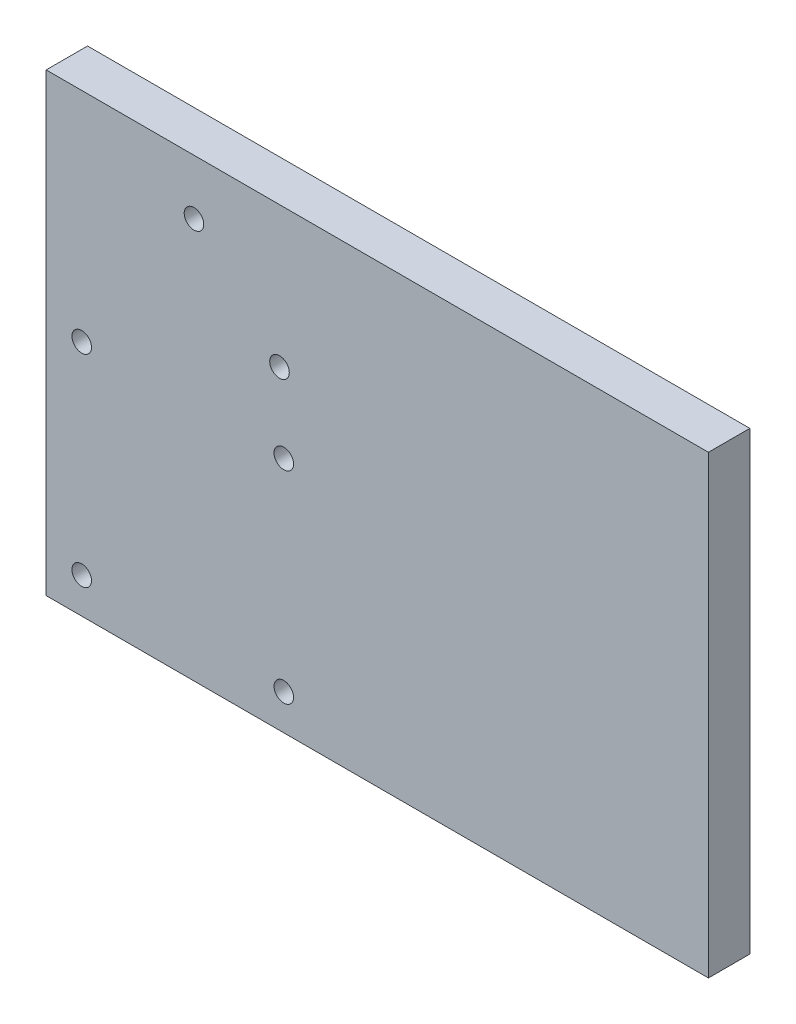
ISO-10303-21;
HEADER;
FILE_DESCRIPTION(('STEP AP214'),'2;1');
FILE_NAME('part.step','',(''),(''),'','','');
FILE_SCHEMA(('AUTOMOTIVE_DESIGN { 1 0 10303 214 1 1 1 1 }'));
ENDSEC;
DATA;
#1=APPLICATION_CONTEXT('core data for automotive mechanical design processes');
#2=APPLICATION_PROTOCOL_DEFINITION('international standard','automotive_design',2000,#1);
#3=PRODUCT_CONTEXT('',#1,'mechanical');
#4=PRODUCT('Part','Part','',(#3));
#5=PRODUCT_RELATED_PRODUCT_CATEGORY('part','',(#4));
#6=PRODUCT_DEFINITION_FORMATION('','',#4);
#7=PRODUCT_DEFINITION_CONTEXT('part definition',#1,'design');
#8=PRODUCT_DEFINITION('design','',#6,#7);
#9=PRODUCT_DEFINITION_SHAPE('','',#8);
#10=(LENGTH_UNIT() NAMED_UNIT(*) SI_UNIT(.MILLI.,.METRE.));
#11=(NAMED_UNIT(*) PLANE_ANGLE_UNIT() SI_UNIT($,.RADIAN.));
#12=(NAMED_UNIT(*) SI_UNIT($,.STERADIAN.) SOLID_ANGLE_UNIT());
#13=UNCERTAINTY_MEASURE_WITH_UNIT(LENGTH_MEASURE(1.E-05),#10,'distance_accuracy_value','');
#14=(GEOMETRIC_REPRESENTATION_CONTEXT(3) GLOBAL_UNCERTAINTY_ASSIGNED_CONTEXT((#13)) GLOBAL_UNIT_ASSIGNED_CONTEXT((#10,
#11,#12)) REPRESENTATION_CONTEXT('',''));
#15=CARTESIAN_POINT('',(0.,0.,0.));
#16=DIRECTION('',(0.,0.,1.));
#17=DIRECTION('',(1.,0.,0.));
#18=AXIS2_PLACEMENT_3D('',#15,#16,#17);
#19=CARTESIAN_POINT('',(0.,0.,6.35));
#20=DIRECTION('',(1.,0.,0.));
#21=DIRECTION('',(0.,0.,-1.));
#22=AXIS2_PLACEMENT_3D('',#19,#20,#21);
#23=PLANE('',#22);
#24=DIRECTION('',(0.,-1.,0.));
#25=VECTOR('',#24,1.);
#26=CARTESIAN_POINT('',(0.,0.,0.));
#27=LINE('',#26,#25);
#28=CARTESIAN_POINT('',(0.,69.85,0.));
#29=VERTEX_POINT('',#28);
#30=CARTESIAN_POINT('',(0.,0.,0.));
#31=VERTEX_POINT('',#30);
#32=EDGE_CURVE('E96',#29,#31,#27,.T.);
#33=ORIENTED_EDGE('',*,*,#32,.T.);
#34=DIRECTION('',(0.,0.,-1.));
#35=VECTOR('',#34,1.);
#36=CARTESIAN_POINT('',(0.,0.,6.35));
#37=LINE('',#36,#35);
#38=CARTESIAN_POINT('',(0.,0.,6.35));
#39=VERTEX_POINT('',#38);
#40=EDGE_CURVE('E11',#39,#31,#37,.T.);
#41=ORIENTED_EDGE('',*,*,#40,.F.);
#42=DIRECTION('',(0.,-1.,0.));
#43=VECTOR('',#42,1.);
#44=CARTESIAN_POINT('',(0.,0.,6.35));
#45=LINE('',#44,#43);
#46=CARTESIAN_POINT('',(0.,69.85,6.35));
#47=VERTEX_POINT('',#46);
#48=EDGE_CURVE('E84',#47,#39,#45,.T.);
#49=ORIENTED_EDGE('',*,*,#48,.F.);
#50=DIRECTION('',(0.,0.,-1.));
#51=VECTOR('',#50,1.);
#52=CARTESIAN_POINT('',(0.,69.85,6.35));
#53=LINE('',#52,#51);
#54=EDGE_CURVE('E92',#47,#29,#53,.T.);
#55=ORIENTED_EDGE('',*,*,#54,.T.);
#56=EDGE_LOOP('',(#33,#41,#49,#55));
#57=FACE_BOUND('',#56,.T.);
#58=ADVANCED_FACE('F33',(#57),#23,.F.);
#59=CARTESIAN_POINT('',(0.,0.,6.35));
#60=DIRECTION('',(0.,1.,0.));
#61=DIRECTION('',(0.,0.,1.));
#62=AXIS2_PLACEMENT_3D('',#59,#60,#61);
#63=PLANE('',#62);
#64=DIRECTION('',(1.,0.,0.));
#65=VECTOR('',#64,1.);
#66=CARTESIAN_POINT('',(0.,0.,0.));
#67=LINE('',#66,#65);
#68=CARTESIAN_POINT('',(101.6,0.,0.));
#69=VERTEX_POINT('',#68);
#70=EDGE_CURVE('E88',#31,#69,#67,.T.);
#71=ORIENTED_EDGE('',*,*,#70,.T.);
#72=DIRECTION('',(0.,0.,-1.));
#73=VECTOR('',#72,1.);
#74=CARTESIAN_POINT('',(101.6,0.,6.35));
#75=LINE('',#74,#73);
#76=CARTESIAN_POINT('',(101.6,0.,6.35));
#77=VERTEX_POINT('',#76);
#78=EDGE_CURVE('E41',#77,#69,#75,.T.);
#79=ORIENTED_EDGE('',*,*,#78,.F.);
#80=DIRECTION('',(1.,0.,0.));
#81=VECTOR('',#80,1.);
#82=CARTESIAN_POINT('',(0.,0.,6.35));
#83=LINE('',#82,#81);
#84=EDGE_CURVE('E79',#39,#77,#83,.T.);
#85=ORIENTED_EDGE('',*,*,#84,.F.);
#86=ORIENTED_EDGE('',*,*,#40,.T.);
#87=EDGE_LOOP('',(#71,#79,#85,#86));
#88=FACE_BOUND('',#87,.T.);
#89=ADVANCED_FACE('F87',(#88),#63,.F.);
#90=CARTESIAN_POINT('',(101.6,0.,6.35));
#91=DIRECTION('',(-1.,0.,0.));
#92=DIRECTION('',(0.,0.,1.));
#93=AXIS2_PLACEMENT_3D('',#90,#91,#92);
#94=PLANE('',#93);
#95=DIRECTION('',(0.,1.,0.));
#96=VECTOR('',#95,1.);
#97=CARTESIAN_POINT('',(101.6,0.,0.));
#98=LINE('',#97,#96);
#99=CARTESIAN_POINT('',(101.6,69.85,0.));
#100=VERTEX_POINT('',#99);
#101=EDGE_CURVE('E66',#69,#100,#98,.T.);
#102=ORIENTED_EDGE('',*,*,#101,.T.);
#103=DIRECTION('',(0.,0.,-1.));
#104=VECTOR('',#103,1.);
#105=CARTESIAN_POINT('',(101.6,69.85,6.35));
#106=LINE('',#105,#104);
#107=CARTESIAN_POINT('',(101.6,69.85,6.35));
#108=VERTEX_POINT('',#107);
#109=EDGE_CURVE('E89',#108,#100,#106,.T.);
#110=ORIENTED_EDGE('',*,*,#109,.F.);
#111=DIRECTION('',(0.,1.,0.));
#112=VECTOR('',#111,1.);
#113=CARTESIAN_POINT('',(101.6,0.,6.35));
#114=LINE('',#113,#112);
#115=EDGE_CURVE('E82',#77,#108,#114,.T.);
#116=ORIENTED_EDGE('',*,*,#115,.F.);
#117=ORIENTED_EDGE('',*,*,#78,.T.);
#118=EDGE_LOOP('',(#102,#110,#116,#117));
#119=FACE_BOUND('',#118,.T.);
#120=ADVANCED_FACE('F90',(#119),#94,.F.);
#121=CARTESIAN_POINT('',(0.,69.85,6.35));
#122=DIRECTION('',(0.,-1.,0.));
#123=DIRECTION('',(0.,0.,-1.));
#124=AXIS2_PLACEMENT_3D('',#121,#122,#123);
#125=PLANE('',#124);
#126=DIRECTION('',(-1.,0.,0.));
#127=VECTOR('',#126,1.);
#128=CARTESIAN_POINT('',(0.,69.85,0.));
#129=LINE('',#128,#127);
#130=EDGE_CURVE('E72',#100,#29,#129,.T.);
#131=ORIENTED_EDGE('',*,*,#130,.T.);
#132=ORIENTED_EDGE('',*,*,#54,.F.);
#133=DIRECTION('',(-1.,0.,0.));
#134=VECTOR('',#133,1.);
#135=CARTESIAN_POINT('',(0.,69.85,6.35));
#136=LINE('',#135,#134);
#137=EDGE_CURVE('E49',#108,#47,#136,.T.);
#138=ORIENTED_EDGE('',*,*,#137,.F.);
#139=ORIENTED_EDGE('',*,*,#109,.T.);
#140=EDGE_LOOP('',(#131,#132,#138,#139));
#141=FACE_BOUND('',#140,.T.);
#142=ADVANCED_FACE('F104',(#141),#125,.F.);
#143=CARTESIAN_POINT('',(0.,0.,6.35));
#144=DIRECTION('',(0.,0.,-1.));
#145=DIRECTION('',(-1.,0.,0.));
#146=AXIS2_PLACEMENT_3D('',#143,#144,#145);
#147=PLANE('',#146);
#148=CARTESIAN_POINT('',(35.7960601717795,48.2779398282206,6.35));
#149=DIRECTION('',(0.,0.,1.));
#150=DIRECTION('',(1.,0.,0.));
#151=AXIS2_PLACEMENT_3D('',#148,#149,#150);
#152=CIRCLE('',#151,1.5);
#153=CARTESIAN_POINT('',(37.2960601717795,48.2779398282206,6.35));
#154=VERTEX_POINT('',#153);
#155=EDGE_CURVE('E140',#154,#154,#152,.T.);
#156=ORIENTED_EDGE('',*,*,#155,.F.);
#157=EDGE_LOOP('',(#156));
#158=FACE_BOUND('',#157,.T.);
#159=CARTESIAN_POINT('',(22.6747398282198,61.3992601717802,6.35));
#160=DIRECTION('',(0.,0.,1.));
#161=DIRECTION('',(1.,0.,0.));
#162=AXIS2_PLACEMENT_3D('',#159,#160,#161);
#163=CIRCLE('',#162,1.5);
#164=CARTESIAN_POINT('',(24.1747398282198,61.3992601717802,6.35));
#165=VERTEX_POINT('',#164);
#166=EDGE_CURVE('E134',#165,#165,#163,.T.);
#167=ORIENTED_EDGE('',*,*,#166,.F.);
#168=EDGE_LOOP('',(#167));
#169=FACE_BOUND('',#168,.T.);
#170=CARTESIAN_POINT('',(36.455,36.455,6.35));
#171=DIRECTION('',(0.,0.,1.));
#172=DIRECTION('',(1.,0.,0.));
#173=AXIS2_PLACEMENT_3D('',#170,#171,#172);
#174=CIRCLE('',#173,1.5);
#175=CARTESIAN_POINT('',(37.955,36.455,6.35));
#176=VERTEX_POINT('',#175);
#177=EDGE_CURVE('E128',#176,#176,#174,.T.);
#178=ORIENTED_EDGE('',*,*,#177,.F.);
#179=EDGE_LOOP('',(#178));
#180=FACE_BOUND('',#179,.T.);
#181=CARTESIAN_POINT('',(36.455,5.45499999999999,6.35));
#182=DIRECTION('',(0.,0.,1.));
#183=DIRECTION('',(1.,0.,0.));
#184=AXIS2_PLACEMENT_3D('',#181,#182,#183);
#185=CIRCLE('',#184,1.5);
#186=CARTESIAN_POINT('',(37.955,5.45499999999999,6.35));
#187=VERTEX_POINT('',#186);
#188=EDGE_CURVE('E122',#187,#187,#185,.T.);
#189=ORIENTED_EDGE('',*,*,#188,.F.);
#190=EDGE_LOOP('',(#189));
#191=FACE_BOUND('',#190,.T.);
#192=CARTESIAN_POINT('',(5.45499999999999,36.455,6.35));
#193=DIRECTION('',(0.,0.,1.));
#194=DIRECTION('',(1.,0.,0.));
#195=AXIS2_PLACEMENT_3D('',#192,#193,#194);
#196=CIRCLE('',#195,1.5);
#197=CARTESIAN_POINT('',(6.95499999999999,36.455,6.35));
#198=VERTEX_POINT('',#197);
#199=EDGE_CURVE('E116',#198,#198,#196,.T.);
#200=ORIENTED_EDGE('',*,*,#199,.F.);
#201=EDGE_LOOP('',(#200));
#202=FACE_BOUND('',#201,.T.);
#203=CARTESIAN_POINT('',(5.45499999999999,5.45499999999999,6.35));
#204=DIRECTION('',(0.,0.,1.));
#205=DIRECTION('',(1.,0.,0.));
#206=AXIS2_PLACEMENT_3D('',#203,#204,#205);
#207=CIRCLE('',#206,1.5);
#208=CARTESIAN_POINT('',(6.95499999999999,5.45499999999999,6.35));
#209=VERTEX_POINT('',#208);
#210=EDGE_CURVE('E110',#209,#209,#207,.T.);
#211=ORIENTED_EDGE('',*,*,#210,.F.);
#212=EDGE_LOOP('',(#211));
#213=FACE_BOUND('',#212,.T.);
#214=ORIENTED_EDGE('',*,*,#48,.T.);
#215=ORIENTED_EDGE('',*,*,#84,.T.);
#216=ORIENTED_EDGE('',*,*,#115,.T.);
#217=ORIENTED_EDGE('',*,*,#137,.T.);
#218=EDGE_LOOP('',(#214,#215,#216,#217));
#219=FACE_BOUND('',#218,.T.);
#220=ADVANCED_FACE('F80',(#158,#169,#180,#191,#202,#213,#219),#147,.F.);
#221=CARTESIAN_POINT('',(0.,0.,0.));
#222=DIRECTION('',(0.,0.,-1.));
#223=DIRECTION('',(-1.,0.,0.));
#224=AXIS2_PLACEMENT_3D('',#221,#222,#223);
#225=PLANE('',#224);
#226=CARTESIAN_POINT('',(35.7960601717795,48.2779398282206,0.));
#227=DIRECTION('',(0.,0.,1.));
#228=DIRECTION('',(1.,0.,0.));
#229=AXIS2_PLACEMENT_3D('',#226,#227,#228);
#230=CIRCLE('',#229,1.5);
#231=CARTESIAN_POINT('',(37.2960601717795,48.2779398282206,0.));
#232=VERTEX_POINT('',#231);
#233=EDGE_CURVE('E137',#232,#232,#230,.T.);
#234=ORIENTED_EDGE('',*,*,#233,.T.);
#235=EDGE_LOOP('',(#234));
#236=FACE_BOUND('',#235,.T.);
#237=CARTESIAN_POINT('',(22.6747398282198,61.3992601717802,0.));
#238=DIRECTION('',(0.,0.,1.));
#239=DIRECTION('',(1.,0.,0.));
#240=AXIS2_PLACEMENT_3D('',#237,#238,#239);
#241=CIRCLE('',#240,1.5);
#242=CARTESIAN_POINT('',(24.1747398282198,61.3992601717802,0.));
#243=VERTEX_POINT('',#242);
#244=EDGE_CURVE('E131',#243,#243,#241,.T.);
#245=ORIENTED_EDGE('',*,*,#244,.T.);
#246=EDGE_LOOP('',(#245));
#247=FACE_BOUND('',#246,.T.);
#248=CARTESIAN_POINT('',(36.455,36.455,0.));
#249=DIRECTION('',(0.,0.,1.));
#250=DIRECTION('',(1.,0.,0.));
#251=AXIS2_PLACEMENT_3D('',#248,#249,#250);
#252=CIRCLE('',#251,1.5);
#253=CARTESIAN_POINT('',(37.955,36.455,0.));
#254=VERTEX_POINT('',#253);
#255=EDGE_CURVE('E125',#254,#254,#252,.T.);
#256=ORIENTED_EDGE('',*,*,#255,.T.);
#257=EDGE_LOOP('',(#256));
#258=FACE_BOUND('',#257,.T.);
#259=CARTESIAN_POINT('',(36.455,5.45499999999999,0.));
#260=DIRECTION('',(0.,0.,1.));
#261=DIRECTION('',(1.,0.,0.));
#262=AXIS2_PLACEMENT_3D('',#259,#260,#261);
#263=CIRCLE('',#262,1.5);
#264=CARTESIAN_POINT('',(37.955,5.45499999999999,0.));
#265=VERTEX_POINT('',#264);
#266=EDGE_CURVE('E119',#265,#265,#263,.T.);
#267=ORIENTED_EDGE('',*,*,#266,.T.);
#268=EDGE_LOOP('',(#267));
#269=FACE_BOUND('',#268,.T.);
#270=CARTESIAN_POINT('',(5.45499999999999,36.455,0.));
#271=DIRECTION('',(0.,0.,1.));
#272=DIRECTION('',(1.,0.,0.));
#273=AXIS2_PLACEMENT_3D('',#270,#271,#272);
#274=CIRCLE('',#273,1.5);
#275=CARTESIAN_POINT('',(6.95499999999999,36.455,0.));
#276=VERTEX_POINT('',#275);
#277=EDGE_CURVE('E113',#276,#276,#274,.T.);
#278=ORIENTED_EDGE('',*,*,#277,.T.);
#279=EDGE_LOOP('',(#278));
#280=FACE_BOUND('',#279,.T.);
#281=CARTESIAN_POINT('',(5.45499999999999,5.45499999999999,0.));
#282=DIRECTION('',(0.,0.,1.));
#283=DIRECTION('',(1.,0.,0.));
#284=AXIS2_PLACEMENT_3D('',#281,#282,#283);
#285=CIRCLE('',#284,1.5);
#286=CARTESIAN_POINT('',(6.95499999999999,5.45499999999999,0.));
#287=VERTEX_POINT('',#286);
#288=EDGE_CURVE('E99',#287,#287,#285,.T.);
#289=ORIENTED_EDGE('',*,*,#288,.T.);
#290=EDGE_LOOP('',(#289));
#291=FACE_BOUND('',#290,.T.);
#292=ORIENTED_EDGE('',*,*,#32,.F.);
#293=ORIENTED_EDGE('',*,*,#130,.F.);
#294=ORIENTED_EDGE('',*,*,#101,.F.);
#295=ORIENTED_EDGE('',*,*,#70,.F.);
#296=EDGE_LOOP('',(#292,#293,#294,#295));
#297=FACE_BOUND('',#296,.T.);
#298=ADVANCED_FACE('F107',(#236,#247,#258,#269,#280,#291,#297),#225,.T.);
#299=CARTESIAN_POINT('',(5.45499999999999,5.45499999999999,0.));
#300=DIRECTION('',(0.,0.,1.));
#301=DIRECTION('',(1.,0.,0.));
#302=AXIS2_PLACEMENT_3D('',#299,#300,#301);
#303=CYLINDRICAL_SURFACE('',#302,1.5);
#304=ORIENTED_EDGE('',*,*,#288,.F.);
#305=EDGE_LOOP('',(#304));
#306=FACE_BOUND('',#305,.T.);
#307=ORIENTED_EDGE('',*,*,#210,.T.);
#308=EDGE_LOOP('',(#307));
#309=FACE_BOUND('',#308,.T.);
#310=ADVANCED_FACE('F168',(#306,#309),#303,.F.);
#311=CARTESIAN_POINT('',(5.45499999999999,36.455,0.));
#312=DIRECTION('',(0.,0.,1.));
#313=DIRECTION('',(1.,0.,0.));
#314=AXIS2_PLACEMENT_3D('',#311,#312,#313);
#315=CYLINDRICAL_SURFACE('',#314,1.5);
#316=ORIENTED_EDGE('',*,*,#277,.F.);
#317=EDGE_LOOP('',(#316));
#318=FACE_BOUND('',#317,.T.);
#319=ORIENTED_EDGE('',*,*,#199,.T.);
#320=EDGE_LOOP('',(#319));
#321=FACE_BOUND('',#320,.T.);
#322=ADVANCED_FACE('F170',(#318,#321),#315,.F.);
#323=CARTESIAN_POINT('',(36.455,5.45499999999999,0.));
#324=DIRECTION('',(0.,0.,1.));
#325=DIRECTION('',(1.,0.,0.));
#326=AXIS2_PLACEMENT_3D('',#323,#324,#325);
#327=CYLINDRICAL_SURFACE('',#326,1.5);
#328=ORIENTED_EDGE('',*,*,#266,.F.);
#329=EDGE_LOOP('',(#328));
#330=FACE_BOUND('',#329,.T.);
#331=ORIENTED_EDGE('',*,*,#188,.T.);
#332=EDGE_LOOP('',(#331));
#333=FACE_BOUND('',#332,.T.);
#334=ADVANCED_FACE('F177',(#330,#333),#327,.F.);
#335=CARTESIAN_POINT('',(36.455,36.455,0.));
#336=DIRECTION('',(0.,0.,1.));
#337=DIRECTION('',(1.,0.,0.));
#338=AXIS2_PLACEMENT_3D('',#335,#336,#337);
#339=CYLINDRICAL_SURFACE('',#338,1.5);
#340=ORIENTED_EDGE('',*,*,#255,.F.);
#341=EDGE_LOOP('',(#340));
#342=FACE_BOUND('',#341,.T.);
#343=ORIENTED_EDGE('',*,*,#177,.T.);
#344=EDGE_LOOP('',(#343));
#345=FACE_BOUND('',#344,.T.);
#346=ADVANCED_FACE('F223',(#342,#345),#339,.F.);
#347=CARTESIAN_POINT('',(22.6747398282198,61.3992601717802,0.));
#348=DIRECTION('',(0.,0.,1.));
#349=DIRECTION('',(1.,0.,0.));
#350=AXIS2_PLACEMENT_3D('',#347,#348,#349);
#351=CYLINDRICAL_SURFACE('',#350,1.5);
#352=ORIENTED_EDGE('',*,*,#244,.F.);
#353=EDGE_LOOP('',(#352));
#354=FACE_BOUND('',#353,.T.);
#355=ORIENTED_EDGE('',*,*,#166,.T.);
#356=EDGE_LOOP('',(#355));
#357=FACE_BOUND('',#356,.T.);
#358=ADVANCED_FACE('F151',(#354,#357),#351,.F.);
#359=CARTESIAN_POINT('',(35.7960601717795,48.2779398282206,0.));
#360=DIRECTION('',(0.,0.,1.));
#361=DIRECTION('',(1.,0.,0.));
#362=AXIS2_PLACEMENT_3D('',#359,#360,#361);
#363=CYLINDRICAL_SURFACE('',#362,1.5);
#364=ORIENTED_EDGE('',*,*,#233,.F.);
#365=EDGE_LOOP('',(#364));
#366=FACE_BOUND('',#365,.T.);
#367=ORIENTED_EDGE('',*,*,#155,.T.);
#368=EDGE_LOOP('',(#367));
#369=FACE_BOUND('',#368,.T.);
#370=ADVANCED_FACE('F148',(#366,#369),#363,.F.);
#371=CLOSED_SHELL('',(#58,#89,#120,#142,#220,#298,#310,#322,#334,#346,#358,#370));
#372=MANIFOLD_SOLID_BREP('B2',#371);
#373=ADVANCED_BREP_SHAPE_REPRESENTATION('',(#18,#372),#14);
#374=SHAPE_DEFINITION_REPRESENTATION(#9,#373);
ENDSEC;
END-ISO-10303-21;
